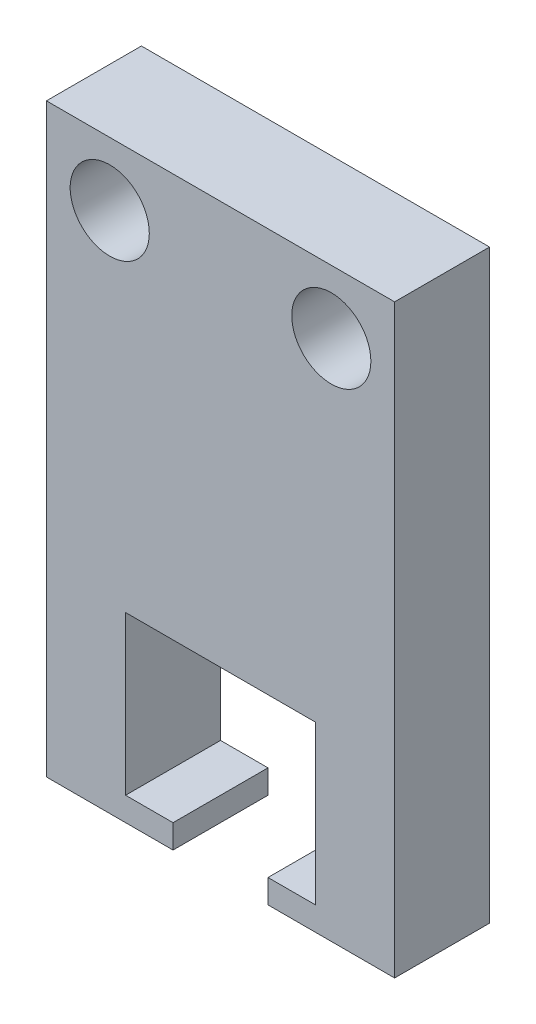
ISO-10303-21;
HEADER;
FILE_DESCRIPTION(('STEP AP214'),'2;1');
FILE_NAME('part.step','',(''),(''),'','','');
FILE_SCHEMA(('AUTOMOTIVE_DESIGN { 1 0 10303 214 1 1 1 1 }'));
ENDSEC;
DATA;
#1=APPLICATION_CONTEXT('core data for automotive mechanical design processes');
#2=APPLICATION_PROTOCOL_DEFINITION('international standard','automotive_design',2000,#1);
#3=PRODUCT_CONTEXT('',#1,'mechanical');
#4=PRODUCT('Part','Part','',(#3));
#5=PRODUCT_RELATED_PRODUCT_CATEGORY('part','',(#4));
#6=PRODUCT_DEFINITION_FORMATION('','',#4);
#7=PRODUCT_DEFINITION_CONTEXT('part definition',#1,'design');
#8=PRODUCT_DEFINITION('design','',#6,#7);
#9=PRODUCT_DEFINITION_SHAPE('','',#8);
#10=(LENGTH_UNIT() NAMED_UNIT(*) SI_UNIT(.MILLI.,.METRE.));
#11=(NAMED_UNIT(*) PLANE_ANGLE_UNIT() SI_UNIT($,.RADIAN.));
#12=(NAMED_UNIT(*) SI_UNIT($,.STERADIAN.) SOLID_ANGLE_UNIT());
#13=UNCERTAINTY_MEASURE_WITH_UNIT(LENGTH_MEASURE(1.E-05),#10,'distance_accuracy_value','');
#14=(GEOMETRIC_REPRESENTATION_CONTEXT(3) GLOBAL_UNCERTAINTY_ASSIGNED_CONTEXT((#13)) GLOBAL_UNIT_ASSIGNED_CONTEXT((#10,
#11,#12)) REPRESENTATION_CONTEXT('',''));
#15=CARTESIAN_POINT('',(0.,0.,0.));
#16=DIRECTION('',(0.,0.,1.));
#17=DIRECTION('',(1.,0.,0.));
#18=AXIS2_PLACEMENT_3D('',#15,#16,#17);
#19=CARTESIAN_POINT('',(0.,-17.,6.));
#20=DIRECTION('',(0.,-1.,0.));
#21=DIRECTION('',(0.,0.,-1.));
#22=AXIS2_PLACEMENT_3D('',#19,#20,#21);
#23=PLANE('',#22);
#24=DIRECTION('',(-1.,0.,0.));
#25=VECTOR('',#24,1.);
#26=CARTESIAN_POINT('',(0.,-17.,6.));
#27=LINE('',#26,#25);
#28=CARTESIAN_POINT('',(-3.,-17.,6.));
#29=VERTEX_POINT('',#28);
#30=CARTESIAN_POINT('',(-6.,-17.,6.));
#31=VERTEX_POINT('',#30);
#32=EDGE_CURVE('E280',#29,#31,#27,.T.);
#33=ORIENTED_EDGE('',*,*,#32,.F.);
#34=DIRECTION('',(0.,0.,-1.));
#35=VECTOR('',#34,1.);
#36=CARTESIAN_POINT('',(-3.,-17.,6.));
#37=LINE('',#36,#35);
#38=CARTESIAN_POINT('',(-3.,-17.,0.));
#39=VERTEX_POINT('',#38);
#40=EDGE_CURVE('E184',#29,#39,#37,.T.);
#41=ORIENTED_EDGE('',*,*,#40,.T.);
#42=DIRECTION('',(-1.,0.,0.));
#43=VECTOR('',#42,1.);
#44=CARTESIAN_POINT('',(0.,-17.,0.));
#45=LINE('',#44,#43);
#46=CARTESIAN_POINT('',(-6.,-17.,0.));
#47=VERTEX_POINT('',#46);
#48=EDGE_CURVE('E287',#39,#47,#45,.T.);
#49=ORIENTED_EDGE('',*,*,#48,.T.);
#50=DIRECTION('',(0.,0.,-1.));
#51=VECTOR('',#50,1.);
#52=CARTESIAN_POINT('',(-6.,-17.,6.));
#53=LINE('',#52,#51);
#54=EDGE_CURVE('E311',#31,#47,#53,.T.);
#55=ORIENTED_EDGE('',*,*,#54,.F.);
#56=EDGE_LOOP('',(#33,#41,#49,#55));
#57=FACE_BOUND('',#56,.T.);
#58=ADVANCED_FACE('F167',(#57),#23,.F.);
#59=CARTESIAN_POINT('',(0.,-18.5,6.));
#60=DIRECTION('',(0.,1.,0.));
#61=DIRECTION('',(0.,0.,1.));
#62=AXIS2_PLACEMENT_3D('',#59,#60,#61);
#63=PLANE('',#62);
#64=DIRECTION('',(1.,0.,0.));
#65=VECTOR('',#64,1.);
#66=CARTESIAN_POINT('',(0.,-18.5,0.));
#67=LINE('',#66,#65);
#68=CARTESIAN_POINT('',(-11.,-18.5,0.));
#69=VERTEX_POINT('',#68);
#70=CARTESIAN_POINT('',(-3.,-18.5,0.));
#71=VERTEX_POINT('',#70);
#72=EDGE_CURVE('E282',#69,#71,#67,.T.);
#73=ORIENTED_EDGE('',*,*,#72,.T.);
#74=DIRECTION('',(0.,0.,-1.));
#75=VECTOR('',#74,1.);
#76=CARTESIAN_POINT('',(-3.,-18.5,6.));
#77=LINE('',#76,#75);
#78=CARTESIAN_POINT('',(-3.,-18.5,6.));
#79=VERTEX_POINT('',#78);
#80=EDGE_CURVE('E372',#79,#71,#77,.T.);
#81=ORIENTED_EDGE('',*,*,#80,.F.);
#82=DIRECTION('',(1.,0.,0.));
#83=VECTOR('',#82,1.);
#84=CARTESIAN_POINT('',(0.,-18.5,6.));
#85=LINE('',#84,#83);
#86=CARTESIAN_POINT('',(-11.,-18.5,6.));
#87=VERTEX_POINT('',#86);
#88=EDGE_CURVE('E12',#87,#79,#85,.T.);
#89=ORIENTED_EDGE('',*,*,#88,.F.);
#90=DIRECTION('',(0.,0.,-1.));
#91=VECTOR('',#90,1.);
#92=CARTESIAN_POINT('',(-11.,-18.5,6.));
#93=LINE('',#92,#91);
#94=EDGE_CURVE('E346',#87,#69,#93,.T.);
#95=ORIENTED_EDGE('',*,*,#94,.T.);
#96=EDGE_LOOP('',(#73,#81,#89,#95));
#97=FACE_BOUND('',#96,.T.);
#98=ADVANCED_FACE('F370',(#97),#63,.F.);
#99=CARTESIAN_POINT('',(6.,-17.,0.));
#100=VERTEX_POINT('',#99);
#101=CARTESIAN_POINT('',(3.,-17.,0.));
#102=VERTEX_POINT('',#101);
#103=EDGE_CURVE('E272',#100,#102,#45,.T.);
#104=ORIENTED_EDGE('',*,*,#103,.T.);
#105=DIRECTION('',(0.,0.,-1.));
#106=VECTOR('',#105,1.);
#107=CARTESIAN_POINT('',(3.,-17.,6.));
#108=LINE('',#107,#106);
#109=CARTESIAN_POINT('',(3.,-17.,6.));
#110=VERTEX_POINT('',#109);
#111=EDGE_CURVE('E258',#110,#102,#108,.T.);
#112=ORIENTED_EDGE('',*,*,#111,.F.);
#113=CARTESIAN_POINT('',(6.,-17.,6.));
#114=VERTEX_POINT('',#113);
#115=EDGE_CURVE('E270',#114,#110,#27,.T.);
#116=ORIENTED_EDGE('',*,*,#115,.F.);
#117=DIRECTION('',(0.,0.,-1.));
#118=VECTOR('',#117,1.);
#119=CARTESIAN_POINT('',(6.,-17.,6.));
#120=LINE('',#119,#118);
#121=EDGE_CURVE('E297',#114,#100,#120,.T.);
#122=ORIENTED_EDGE('',*,*,#121,.T.);
#123=EDGE_LOOP('',(#104,#112,#116,#122));
#124=FACE_BOUND('',#123,.T.);
#125=ADVANCED_FACE('F268',(#124),#23,.F.);
#126=CARTESIAN_POINT('',(3.,-18.5,6.));
#127=VERTEX_POINT('',#126);
#128=CARTESIAN_POINT('',(11.,-18.5,6.));
#129=VERTEX_POINT('',#128);
#130=EDGE_CURVE('E176',#127,#129,#85,.T.);
#131=ORIENTED_EDGE('',*,*,#130,.F.);
#132=DIRECTION('',(0.,0.,-1.));
#133=VECTOR('',#132,1.);
#134=CARTESIAN_POINT('',(3.,-18.5,6.));
#135=LINE('',#134,#133);
#136=CARTESIAN_POINT('',(3.,-18.5,0.));
#137=VERTEX_POINT('',#136);
#138=EDGE_CURVE('E192',#127,#137,#135,.T.);
#139=ORIENTED_EDGE('',*,*,#138,.T.);
#140=CARTESIAN_POINT('',(11.,-18.5,0.));
#141=VERTEX_POINT('',#140);
#142=EDGE_CURVE('E286',#137,#141,#67,.T.);
#143=ORIENTED_EDGE('',*,*,#142,.T.);
#144=DIRECTION('',(0.,0.,-1.));
#145=VECTOR('',#144,1.);
#146=CARTESIAN_POINT('',(11.,-18.5,6.));
#147=LINE('',#146,#145);
#148=EDGE_CURVE('E348',#129,#141,#147,.T.);
#149=ORIENTED_EDGE('',*,*,#148,.F.);
#150=EDGE_LOOP('',(#131,#139,#143,#149));
#151=FACE_BOUND('',#150,.T.);
#152=ADVANCED_FACE('F374',(#151),#63,.F.);
#153=CARTESIAN_POINT('',(0.,0.,0.));
#154=DIRECTION('',(0.,0.,1.));
#155=DIRECTION('',(1.,0.,0.));
#156=AXIS2_PLACEMENT_3D('',#153,#154,#155);
#157=PLANE('',#156);
#158=ORIENTED_EDGE('',*,*,#48,.F.);
#159=DIRECTION('',(0.,1.,0.));
#160=VECTOR('',#159,1.);
#161=CARTESIAN_POINT('',(-3.,-17.,0.));
#162=LINE('',#161,#160);
#163=EDGE_CURVE('E264',#71,#39,#162,.T.);
#164=ORIENTED_EDGE('',*,*,#163,.F.);
#165=ORIENTED_EDGE('',*,*,#72,.F.);
#166=DIRECTION('',(0.,-1.,0.));
#167=VECTOR('',#166,1.);
#168=CARTESIAN_POINT('',(-11.,18.5,0.));
#169=LINE('',#168,#167);
#170=CARTESIAN_POINT('',(-11.,18.5,0.));
#171=VERTEX_POINT('',#170);
#172=EDGE_CURVE('E331',#171,#69,#169,.T.);
#173=ORIENTED_EDGE('',*,*,#172,.F.);
#174=DIRECTION('',(1.,0.,0.));
#175=VECTOR('',#174,1.);
#176=CARTESIAN_POINT('',(-11.,18.5,0.));
#177=LINE('',#176,#175);
#178=CARTESIAN_POINT('',(11.,18.5,0.));
#179=VERTEX_POINT('',#178);
#180=EDGE_CURVE('E324',#171,#179,#177,.T.);
#181=ORIENTED_EDGE('',*,*,#180,.T.);
#182=DIRECTION('',(0.,-1.,0.));
#183=VECTOR('',#182,1.);
#184=CARTESIAN_POINT('',(11.,18.5,0.));
#185=LINE('',#184,#183);
#186=EDGE_CURVE('E339',#179,#141,#185,.T.);
#187=ORIENTED_EDGE('',*,*,#186,.T.);
#188=ORIENTED_EDGE('',*,*,#142,.F.);
#189=DIRECTION('',(0.,-1.,0.));
#190=VECTOR('',#189,1.);
#191=CARTESIAN_POINT('',(3.,-17.,0.));
#192=LINE('',#191,#190);
#193=EDGE_CURVE('E375',#102,#137,#192,.T.);
#194=ORIENTED_EDGE('',*,*,#193,.F.);
#195=ORIENTED_EDGE('',*,*,#103,.F.);
#196=DIRECTION('',(0.,-1.,0.));
#197=VECTOR('',#196,1.);
#198=CARTESIAN_POINT('',(6.,-7.,0.));
#199=LINE('',#198,#197);
#200=CARTESIAN_POINT('',(6.,-7.,0.));
#201=VERTEX_POINT('',#200);
#202=EDGE_CURVE('E298',#201,#100,#199,.T.);
#203=ORIENTED_EDGE('',*,*,#202,.F.);
#204=DIRECTION('',(-1.,0.,0.));
#205=VECTOR('',#204,1.);
#206=CARTESIAN_POINT('',(6.,-7.,0.));
#207=LINE('',#206,#205);
#208=CARTESIAN_POINT('',(-6.,-7.,0.));
#209=VERTEX_POINT('',#208);
#210=EDGE_CURVE('E292',#201,#209,#207,.T.);
#211=ORIENTED_EDGE('',*,*,#210,.T.);
#212=DIRECTION('',(0.,-1.,0.));
#213=VECTOR('',#212,1.);
#214=CARTESIAN_POINT('',(-6.,-7.,0.));
#215=LINE('',#214,#213);
#216=EDGE_CURVE('E301',#209,#47,#215,.T.);
#217=ORIENTED_EDGE('',*,*,#216,.T.);
#218=EDGE_LOOP('',(#158,#164,#165,#173,#181,#187,#188,#194,#195,#203,#211,#217));
#219=FACE_BOUND('',#218,.T.);
#220=CARTESIAN_POINT('',(-7.,14.5,0.));
#221=DIRECTION('',(0.,0.,1.));
#222=DIRECTION('',(1.,0.,0.));
#223=AXIS2_PLACEMENT_3D('',#220,#221,#222);
#224=CIRCLE('',#223,2.5);
#225=CARTESIAN_POINT('',(-4.5,14.5,0.));
#226=VERTEX_POINT('',#225);
#227=EDGE_CURVE('E318',#226,#226,#224,.T.);
#228=ORIENTED_EDGE('',*,*,#227,.T.);
#229=EDGE_LOOP('',(#228));
#230=FACE_BOUND('',#229,.T.);
#231=CARTESIAN_POINT('',(7.,14.5,0.));
#232=DIRECTION('',(0.,0.,1.));
#233=DIRECTION('',(1.,0.,0.));
#234=AXIS2_PLACEMENT_3D('',#231,#232,#233);
#235=CIRCLE('',#234,2.5);
#236=CARTESIAN_POINT('',(9.5,14.5,0.));
#237=VERTEX_POINT('',#236);
#238=EDGE_CURVE('E308',#237,#237,#235,.T.);
#239=ORIENTED_EDGE('',*,*,#238,.T.);
#240=EDGE_LOOP('',(#239));
#241=FACE_BOUND('',#240,.T.);
#242=ADVANCED_FACE('F362',(#219,#230,#241),#157,.F.);
#243=CARTESIAN_POINT('',(0.,0.,6.));
#244=DIRECTION('',(0.,0.,1.));
#245=DIRECTION('',(1.,0.,0.));
#246=AXIS2_PLACEMENT_3D('',#243,#244,#245);
#247=PLANE('',#246);
#248=DIRECTION('',(0.,1.,0.));
#249=VECTOR('',#248,1.);
#250=CARTESIAN_POINT('',(-3.,-17.,6.));
#251=LINE('',#250,#249);
#252=EDGE_CURVE('E263',#79,#29,#251,.T.);
#253=ORIENTED_EDGE('',*,*,#252,.T.);
#254=ORIENTED_EDGE('',*,*,#32,.T.);
#255=DIRECTION('',(0.,-1.,0.));
#256=VECTOR('',#255,1.);
#257=CARTESIAN_POINT('',(-6.,-7.,6.));
#258=LINE('',#257,#256);
#259=CARTESIAN_POINT('',(-6.,-7.,6.));
#260=VERTEX_POINT('',#259);
#261=EDGE_CURVE('E291',#260,#31,#258,.T.);
#262=ORIENTED_EDGE('',*,*,#261,.F.);
#263=DIRECTION('',(-1.,0.,0.));
#264=VECTOR('',#263,1.);
#265=CARTESIAN_POINT('',(6.,-7.,6.));
#266=LINE('',#265,#264);
#267=CARTESIAN_POINT('',(6.,-7.,6.));
#268=VERTEX_POINT('',#267);
#269=EDGE_CURVE('E295',#268,#260,#266,.T.);
#270=ORIENTED_EDGE('',*,*,#269,.F.);
#271=DIRECTION('',(0.,-1.,0.));
#272=VECTOR('',#271,1.);
#273=CARTESIAN_POINT('',(6.,-7.,6.));
#274=LINE('',#273,#272);
#275=EDGE_CURVE('E279',#268,#114,#274,.T.);
#276=ORIENTED_EDGE('',*,*,#275,.T.);
#277=ORIENTED_EDGE('',*,*,#115,.T.);
#278=DIRECTION('',(0.,-1.,0.));
#279=VECTOR('',#278,1.);
#280=CARTESIAN_POINT('',(3.,-17.,6.));
#281=LINE('',#280,#279);
#282=EDGE_CURVE('E255',#110,#127,#281,.T.);
#283=ORIENTED_EDGE('',*,*,#282,.T.);
#284=ORIENTED_EDGE('',*,*,#130,.T.);
#285=DIRECTION('',(0.,-1.,0.));
#286=VECTOR('',#285,1.);
#287=CARTESIAN_POINT('',(11.,18.5,6.));
#288=LINE('',#287,#286);
#289=CARTESIAN_POINT('',(11.,18.5,6.));
#290=VERTEX_POINT('',#289);
#291=EDGE_CURVE('E330',#290,#129,#288,.T.);
#292=ORIENTED_EDGE('',*,*,#291,.F.);
#293=DIRECTION('',(1.,0.,0.));
#294=VECTOR('',#293,1.);
#295=CARTESIAN_POINT('',(-11.,18.5,6.));
#296=LINE('',#295,#294);
#297=CARTESIAN_POINT('',(-11.,18.5,6.));
#298=VERTEX_POINT('',#297);
#299=EDGE_CURVE('E327',#298,#290,#296,.T.);
#300=ORIENTED_EDGE('',*,*,#299,.F.);
#301=DIRECTION('',(0.,-1.,0.));
#302=VECTOR('',#301,1.);
#303=CARTESIAN_POINT('',(-11.,18.5,6.));
#304=LINE('',#303,#302);
#305=EDGE_CURVE('E334',#298,#87,#304,.T.);
#306=ORIENTED_EDGE('',*,*,#305,.T.);
#307=ORIENTED_EDGE('',*,*,#88,.T.);
#308=EDGE_LOOP('',(#253,#254,#262,#270,#276,#277,#283,#284,#292,#300,#306,#307));
#309=FACE_BOUND('',#308,.T.);
#310=CARTESIAN_POINT('',(-7.,14.5,6.));
#311=DIRECTION('',(0.,0.,1.));
#312=DIRECTION('',(1.,0.,0.));
#313=AXIS2_PLACEMENT_3D('',#310,#311,#312);
#314=CIRCLE('',#313,2.5);
#315=CARTESIAN_POINT('',(-4.5,14.5,6.));
#316=VERTEX_POINT('',#315);
#317=EDGE_CURVE('E321',#316,#316,#314,.T.);
#318=ORIENTED_EDGE('',*,*,#317,.F.);
#319=EDGE_LOOP('',(#318));
#320=FACE_BOUND('',#319,.T.);
#321=CARTESIAN_POINT('',(7.,14.5,6.));
#322=DIRECTION('',(0.,0.,1.));
#323=DIRECTION('',(1.,0.,0.));
#324=AXIS2_PLACEMENT_3D('',#321,#322,#323);
#325=CIRCLE('',#324,2.5);
#326=CARTESIAN_POINT('',(9.5,14.5,6.));
#327=VERTEX_POINT('',#326);
#328=EDGE_CURVE('E315',#327,#327,#325,.T.);
#329=ORIENTED_EDGE('',*,*,#328,.F.);
#330=EDGE_LOOP('',(#329));
#331=FACE_BOUND('',#330,.T.);
#332=ADVANCED_FACE('F275',(#309,#320,#331),#247,.T.);
#333=CARTESIAN_POINT('',(7.,14.5,6.));
#334=DIRECTION('',(0.,0.,-1.));
#335=DIRECTION('',(-1.,0.,0.));
#336=AXIS2_PLACEMENT_3D('',#333,#334,#335);
#337=CYLINDRICAL_SURFACE('',#336,2.5);
#338=ORIENTED_EDGE('',*,*,#328,.T.);
#339=EDGE_LOOP('',(#338));
#340=FACE_BOUND('',#339,.T.);
#341=ORIENTED_EDGE('',*,*,#238,.F.);
#342=EDGE_LOOP('',(#341));
#343=FACE_BOUND('',#342,.T.);
#344=ADVANCED_FACE('F398',(#340,#343),#337,.F.);
#345=CARTESIAN_POINT('',(-7.,14.5,6.));
#346=DIRECTION('',(0.,0.,-1.));
#347=DIRECTION('',(-1.,0.,0.));
#348=AXIS2_PLACEMENT_3D('',#345,#346,#347);
#349=CYLINDRICAL_SURFACE('',#348,2.5);
#350=ORIENTED_EDGE('',*,*,#317,.T.);
#351=EDGE_LOOP('',(#350));
#352=FACE_BOUND('',#351,.T.);
#353=ORIENTED_EDGE('',*,*,#227,.F.);
#354=EDGE_LOOP('',(#353));
#355=FACE_BOUND('',#354,.T.);
#356=ADVANCED_FACE('F409',(#352,#355),#349,.F.);
#357=CARTESIAN_POINT('',(11.,18.5,6.));
#358=DIRECTION('',(1.,0.,0.));
#359=DIRECTION('',(0.,0.,-1.));
#360=AXIS2_PLACEMENT_3D('',#357,#358,#359);
#361=PLANE('',#360);
#362=ORIENTED_EDGE('',*,*,#186,.F.);
#363=DIRECTION('',(0.,0.,-1.));
#364=VECTOR('',#363,1.);
#365=CARTESIAN_POINT('',(11.,18.5,6.));
#366=LINE('',#365,#364);
#367=EDGE_CURVE('E171',#290,#179,#366,.T.);
#368=ORIENTED_EDGE('',*,*,#367,.F.);
#369=ORIENTED_EDGE('',*,*,#291,.T.);
#370=ORIENTED_EDGE('',*,*,#148,.T.);
#371=EDGE_LOOP('',(#362,#368,#369,#370));
#372=FACE_BOUND('',#371,.T.);
#373=ADVANCED_FACE('F357',(#372),#361,.T.);
#374=CARTESIAN_POINT('',(-11.,18.5,6.));
#375=DIRECTION('',(0.,1.,0.));
#376=DIRECTION('',(0.,0.,1.));
#377=AXIS2_PLACEMENT_3D('',#374,#375,#376);
#378=PLANE('',#377);
#379=ORIENTED_EDGE('',*,*,#180,.F.);
#380=DIRECTION('',(0.,0.,-1.));
#381=VECTOR('',#380,1.);
#382=CARTESIAN_POINT('',(-11.,18.5,6.));
#383=LINE('',#382,#381);
#384=EDGE_CURVE('E344',#298,#171,#383,.T.);
#385=ORIENTED_EDGE('',*,*,#384,.F.);
#386=ORIENTED_EDGE('',*,*,#299,.T.);
#387=ORIENTED_EDGE('',*,*,#367,.T.);
#388=EDGE_LOOP('',(#379,#385,#386,#387));
#389=FACE_BOUND('',#388,.T.);
#390=ADVANCED_FACE('F169',(#389),#378,.T.);
#391=CARTESIAN_POINT('',(-11.,18.5,6.));
#392=DIRECTION('',(1.,0.,0.));
#393=DIRECTION('',(0.,0.,-1.));
#394=AXIS2_PLACEMENT_3D('',#391,#392,#393);
#395=PLANE('',#394);
#396=ORIENTED_EDGE('',*,*,#172,.T.);
#397=ORIENTED_EDGE('',*,*,#94,.F.);
#398=ORIENTED_EDGE('',*,*,#305,.F.);
#399=ORIENTED_EDGE('',*,*,#384,.T.);
#400=EDGE_LOOP('',(#396,#397,#398,#399));
#401=FACE_BOUND('',#400,.T.);
#402=ADVANCED_FACE('F367',(#401),#395,.F.);
#403=CARTESIAN_POINT('',(-6.,-7.,6.));
#404=DIRECTION('',(1.,0.,0.));
#405=DIRECTION('',(0.,1.,0.));
#406=AXIS2_PLACEMENT_3D('',#403,#404,#405);
#407=PLANE('',#406);
#408=ORIENTED_EDGE('',*,*,#216,.F.);
#409=DIRECTION('',(0.,0.,-1.));
#410=VECTOR('',#409,1.);
#411=CARTESIAN_POINT('',(-6.,-7.,6.));
#412=LINE('',#411,#410);
#413=EDGE_CURVE('E309',#260,#209,#412,.T.);
#414=ORIENTED_EDGE('',*,*,#413,.F.);
#415=ORIENTED_EDGE('',*,*,#261,.T.);
#416=ORIENTED_EDGE('',*,*,#54,.T.);
#417=EDGE_LOOP('',(#408,#414,#415,#416));
#418=FACE_BOUND('',#417,.T.);
#419=ADVANCED_FACE('F388',(#418),#407,.T.);
#420=CARTESIAN_POINT('',(6.,-7.,6.));
#421=DIRECTION('',(0.,-1.,0.));
#422=DIRECTION('',(1.,0.,0.));
#423=AXIS2_PLACEMENT_3D('',#420,#421,#422);
#424=PLANE('',#423);
#425=ORIENTED_EDGE('',*,*,#210,.F.);
#426=DIRECTION('',(0.,0.,-1.));
#427=VECTOR('',#426,1.);
#428=CARTESIAN_POINT('',(6.,-7.,6.));
#429=LINE('',#428,#427);
#430=EDGE_CURVE('E306',#268,#201,#429,.T.);
#431=ORIENTED_EDGE('',*,*,#430,.F.);
#432=ORIENTED_EDGE('',*,*,#269,.T.);
#433=ORIENTED_EDGE('',*,*,#413,.T.);
#434=EDGE_LOOP('',(#425,#431,#432,#433));
#435=FACE_BOUND('',#434,.T.);
#436=ADVANCED_FACE('F393',(#435),#424,.T.);
#437=CARTESIAN_POINT('',(6.,-7.,6.));
#438=DIRECTION('',(1.,0.,0.));
#439=DIRECTION('',(0.,1.,0.));
#440=AXIS2_PLACEMENT_3D('',#437,#438,#439);
#441=PLANE('',#440);
#442=ORIENTED_EDGE('',*,*,#202,.T.);
#443=ORIENTED_EDGE('',*,*,#121,.F.);
#444=ORIENTED_EDGE('',*,*,#275,.F.);
#445=ORIENTED_EDGE('',*,*,#430,.T.);
#446=EDGE_LOOP('',(#442,#443,#444,#445));
#447=FACE_BOUND('',#446,.T.);
#448=ADVANCED_FACE('F395',(#447),#441,.F.);
#449=CARTESIAN_POINT('',(3.,-17.,6.));
#450=DIRECTION('',(1.,0.,0.));
#451=DIRECTION('',(0.,1.,0.));
#452=AXIS2_PLACEMENT_3D('',#449,#450,#451);
#453=PLANE('',#452);
#454=ORIENTED_EDGE('',*,*,#193,.T.);
#455=ORIENTED_EDGE('',*,*,#138,.F.);
#456=ORIENTED_EDGE('',*,*,#282,.F.);
#457=ORIENTED_EDGE('',*,*,#111,.T.);
#458=EDGE_LOOP('',(#454,#455,#456,#457));
#459=FACE_BOUND('',#458,.T.);
#460=ADVANCED_FACE('F257',(#459),#453,.F.);
#461=CARTESIAN_POINT('',(-3.,-17.,6.));
#462=DIRECTION('',(-1.,0.,0.));
#463=DIRECTION('',(0.,-1.,0.));
#464=AXIS2_PLACEMENT_3D('',#461,#462,#463);
#465=PLANE('',#464);
#466=ORIENTED_EDGE('',*,*,#163,.T.);
#467=ORIENTED_EDGE('',*,*,#40,.F.);
#468=ORIENTED_EDGE('',*,*,#252,.F.);
#469=ORIENTED_EDGE('',*,*,#80,.T.);
#470=EDGE_LOOP('',(#466,#467,#468,#469));
#471=FACE_BOUND('',#470,.T.);
#472=ADVANCED_FACE('F382',(#471),#465,.F.);
#473=CLOSED_SHELL('',(#58,#98,#125,#152,#242,#332,#344,#356,#373,#390,#402,#419,#436,#448,#460,#472));
#474=MANIFOLD_SOLID_BREP('B2',#473);
#475=ADVANCED_BREP_SHAPE_REPRESENTATION('',(#18,#474),#14);
#476=SHAPE_DEFINITION_REPRESENTATION(#9,#475);
ENDSEC;
END-ISO-10303-21;
